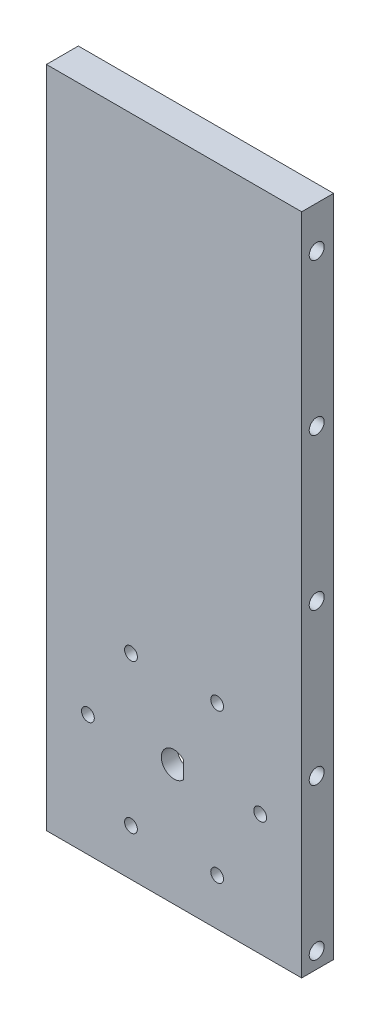
ISO-10303-21;
HEADER;
FILE_DESCRIPTION(('STEP AP214'),'2;1');
FILE_NAME('part.step','',(''),(''),'','','');
FILE_SCHEMA(('AUTOMOTIVE_DESIGN { 1 0 10303 214 1 1 1 1 }'));
ENDSEC;
DATA;
#1=APPLICATION_CONTEXT('core data for automotive mechanical design processes');
#2=APPLICATION_PROTOCOL_DEFINITION('international standard','automotive_design',2000,#1);
#3=PRODUCT_CONTEXT('',#1,'mechanical');
#4=PRODUCT('Part','Part','',(#3));
#5=PRODUCT_RELATED_PRODUCT_CATEGORY('part','',(#4));
#6=PRODUCT_DEFINITION_FORMATION('','',#4);
#7=PRODUCT_DEFINITION_CONTEXT('part definition',#1,'design');
#8=PRODUCT_DEFINITION('design','',#6,#7);
#9=PRODUCT_DEFINITION_SHAPE('','',#8);
#10=(LENGTH_UNIT() NAMED_UNIT(*) SI_UNIT(.MILLI.,.METRE.));
#11=(NAMED_UNIT(*) PLANE_ANGLE_UNIT() SI_UNIT($,.RADIAN.));
#12=(NAMED_UNIT(*) SI_UNIT($,.STERADIAN.) SOLID_ANGLE_UNIT());
#13=UNCERTAINTY_MEASURE_WITH_UNIT(LENGTH_MEASURE(1.E-05),#10,'distance_accuracy_value','');
#14=(GEOMETRIC_REPRESENTATION_CONTEXT(3) GLOBAL_UNCERTAINTY_ASSIGNED_CONTEXT((#13)) GLOBAL_UNIT_ASSIGNED_CONTEXT((#10,
#11,#12)) REPRESENTATION_CONTEXT('',''));
#15=CARTESIAN_POINT('',(0.,0.,0.));
#16=DIRECTION('',(0.,0.,1.));
#17=DIRECTION('',(1.,0.,0.));
#18=AXIS2_PLACEMENT_3D('',#15,#16,#17);
#19=CARTESIAN_POINT('',(40.,30.,0.));
#20=DIRECTION('',(0.,0.,1.));
#21=DIRECTION('',(1.,0.,0.));
#22=AXIS2_PLACEMENT_3D('',#19,#20,#21);
#23=CYLINDRICAL_SURFACE('',#22,4.);
#24=CARTESIAN_POINT('',(40.,30.,5.));
#25=DIRECTION('',(0.,0.,-1.));
#26=DIRECTION('',(-1.,0.,0.));
#27=AXIS2_PLACEMENT_3D('',#24,#25,#26);
#28=CIRCLE('',#27,4.);
#29=CARTESIAN_POINT('',(42.9047375096555,32.75,5.));
#30=VERTEX_POINT('',#29);
#31=CARTESIAN_POINT('',(42.9047375096555,27.25,5.));
#32=VERTEX_POINT('',#31);
#33=EDGE_CURVE('E61',#30,#32,#28,.F.);
#34=ORIENTED_EDGE('',*,*,#33,.F.);
#35=DIRECTION('',(0.,0.,1.));
#36=VECTOR('',#35,1.);
#37=CARTESIAN_POINT('',(42.9047375096555,32.75,0.));
#38=LINE('',#37,#36);
#39=CARTESIAN_POINT('',(42.9047375096555,32.75,10.));
#40=VERTEX_POINT('',#39);
#41=EDGE_CURVE('E113',#30,#40,#38,.T.);
#42=ORIENTED_EDGE('',*,*,#41,.T.);
#43=CARTESIAN_POINT('',(40.,30.,10.));
#44=DIRECTION('',(0.,0.,1.));
#45=DIRECTION('',(1.,0.,0.));
#46=AXIS2_PLACEMENT_3D('',#43,#44,#45);
#47=CIRCLE('',#46,4.);
#48=CARTESIAN_POINT('',(42.9047375096555,27.25,10.));
#49=VERTEX_POINT('',#48);
#50=EDGE_CURVE('E176',#40,#49,#47,.T.);
#51=ORIENTED_EDGE('',*,*,#50,.T.);
#52=DIRECTION('',(0.,0.,1.));
#53=VECTOR('',#52,1.);
#54=CARTESIAN_POINT('',(42.9047375096555,27.25,0.));
#55=LINE('',#54,#53);
#56=EDGE_CURVE('E68',#32,#49,#55,.T.);
#57=ORIENTED_EDGE('',*,*,#56,.F.);
#58=EDGE_LOOP('',(#34,#42,#51,#57));
#59=FACE_BOUND('',#58,.T.);
#60=ADVANCED_FACE('F45',(#59),#23,.F.);
#61=CARTESIAN_POINT('',(42.9047375096555,27.25,0.));
#62=DIRECTION('',(1.,0.,0.));
#63=DIRECTION('',(0.,0.,-1.));
#64=AXIS2_PLACEMENT_3D('',#61,#62,#63);
#65=PLANE('',#64);
#66=DIRECTION('',(0.,1.,0.));
#67=VECTOR('',#66,1.);
#68=CARTESIAN_POINT('',(42.9047375096555,27.25,5.));
#69=LINE('',#68,#67);
#70=EDGE_CURVE('E166',#32,#30,#69,.T.);
#71=ORIENTED_EDGE('',*,*,#70,.F.);
#72=ORIENTED_EDGE('',*,*,#56,.T.);
#73=DIRECTION('',(0.,1.,0.));
#74=VECTOR('',#73,1.);
#75=CARTESIAN_POINT('',(42.9047375096555,27.25,10.));
#76=LINE('',#75,#74);
#77=EDGE_CURVE('E198',#49,#40,#76,.T.);
#78=ORIENTED_EDGE('',*,*,#77,.T.);
#79=ORIENTED_EDGE('',*,*,#41,.F.);
#80=EDGE_LOOP('',(#71,#72,#78,#79));
#81=FACE_BOUND('',#80,.T.);
#82=ADVANCED_FACE('F245',(#81),#65,.F.);
#83=CARTESIAN_POINT('',(26.5,6.61731409782015,10.));
#84=DIRECTION('',(0.,0.,-1.));
#85=DIRECTION('',(-1.,0.,0.));
#86=AXIS2_PLACEMENT_3D('',#83,#84,#85);
#87=CYLINDRICAL_SURFACE('',#86,2.00000000000001);
#88=CARTESIAN_POINT('',(26.5,6.61731409782015,10.));
#89=DIRECTION('',(0.,0.,-1.));
#90=DIRECTION('',(-1.,0.,0.));
#91=AXIS2_PLACEMENT_3D('',#88,#89,#90);
#92=CIRCLE('',#91,2.00000000000001);
#93=CARTESIAN_POINT('',(24.5,6.61731409782015,10.));
#94=VERTEX_POINT('',#93);
#95=EDGE_CURVE('E177',#94,#94,#92,.T.);
#96=ORIENTED_EDGE('',*,*,#95,.F.);
#97=EDGE_LOOP('',(#96));
#98=FACE_BOUND('',#97,.T.);
#99=CARTESIAN_POINT('',(26.5,6.61731409782015,5.));
#100=DIRECTION('',(0.,0.,-1.));
#101=DIRECTION('',(-1.,0.,0.));
#102=AXIS2_PLACEMENT_3D('',#99,#100,#101);
#103=CIRCLE('',#102,2.00000000000001);
#104=CARTESIAN_POINT('',(24.5,6.61731409782015,5.));
#105=VERTEX_POINT('',#104);
#106=EDGE_CURVE('E162',#105,#105,#103,.F.);
#107=ORIENTED_EDGE('',*,*,#106,.F.);
#108=EDGE_LOOP('',(#107));
#109=FACE_BOUND('',#108,.T.);
#110=ADVANCED_FACE('F252',(#98,#109),#87,.F.);
#111=CARTESIAN_POINT('',(53.5,6.61731409782015,10.));
#112=DIRECTION('',(0.,0.,-1.));
#113=DIRECTION('',(-1.,0.,0.));
#114=AXIS2_PLACEMENT_3D('',#111,#112,#113);
#115=CYLINDRICAL_SURFACE('',#114,2.);
#116=CARTESIAN_POINT('',(53.5,6.61731409782015,10.));
#117=DIRECTION('',(0.,0.,-1.));
#118=DIRECTION('',(-1.,0.,0.));
#119=AXIS2_PLACEMENT_3D('',#116,#117,#118);
#120=CIRCLE('',#119,2.);
#121=CARTESIAN_POINT('',(51.5,6.61731409782015,10.));
#122=VERTEX_POINT('',#121);
#123=EDGE_CURVE('E185',#122,#122,#120,.T.);
#124=ORIENTED_EDGE('',*,*,#123,.F.);
#125=EDGE_LOOP('',(#124));
#126=FACE_BOUND('',#125,.T.);
#127=CARTESIAN_POINT('',(53.5,6.61731409782015,5.));
#128=DIRECTION('',(0.,0.,-1.));
#129=DIRECTION('',(-1.,0.,0.));
#130=AXIS2_PLACEMENT_3D('',#127,#128,#129);
#131=CIRCLE('',#130,2.);
#132=CARTESIAN_POINT('',(51.5,6.61731409782015,5.));
#133=VERTEX_POINT('',#132);
#134=EDGE_CURVE('E158',#133,#133,#131,.F.);
#135=ORIENTED_EDGE('',*,*,#134,.F.);
#136=EDGE_LOOP('',(#135));
#137=FACE_BOUND('',#136,.T.);
#138=ADVANCED_FACE('F625',(#126,#137),#115,.F.);
#139=CARTESIAN_POINT('',(67.,30.,10.));
#140=DIRECTION('',(0.,0.,-1.));
#141=DIRECTION('',(-1.,0.,0.));
#142=AXIS2_PLACEMENT_3D('',#139,#140,#141);
#143=CYLINDRICAL_SURFACE('',#142,2.);
#144=CARTESIAN_POINT('',(67.,30.,10.));
#145=DIRECTION('',(0.,0.,-1.));
#146=DIRECTION('',(-1.,0.,0.));
#147=AXIS2_PLACEMENT_3D('',#144,#145,#146);
#148=CIRCLE('',#147,2.);
#149=CARTESIAN_POINT('',(65.,30.,10.));
#150=VERTEX_POINT('',#149);
#151=EDGE_CURVE('E189',#150,#150,#148,.T.);
#152=ORIENTED_EDGE('',*,*,#151,.F.);
#153=EDGE_LOOP('',(#152));
#154=FACE_BOUND('',#153,.T.);
#155=CARTESIAN_POINT('',(67.,30.,5.));
#156=DIRECTION('',(0.,0.,-1.));
#157=DIRECTION('',(-1.,0.,0.));
#158=AXIS2_PLACEMENT_3D('',#155,#156,#157);
#159=CIRCLE('',#158,2.);
#160=CARTESIAN_POINT('',(65.,30.,5.));
#161=VERTEX_POINT('',#160);
#162=EDGE_CURVE('E154',#161,#161,#159,.F.);
#163=ORIENTED_EDGE('',*,*,#162,.F.);
#164=EDGE_LOOP('',(#163));
#165=FACE_BOUND('',#164,.T.);
#166=ADVANCED_FACE('F635',(#154,#165),#143,.F.);
#167=CARTESIAN_POINT('',(53.5,53.3826859021799,10.));
#168=DIRECTION('',(0.,0.,-1.));
#169=DIRECTION('',(-1.,0.,0.));
#170=AXIS2_PLACEMENT_3D('',#167,#168,#169);
#171=CYLINDRICAL_SURFACE('',#170,2.);
#172=CARTESIAN_POINT('',(53.5,53.3826859021799,10.));
#173=DIRECTION('',(0.,0.,-1.));
#174=DIRECTION('',(-1.,0.,0.));
#175=AXIS2_PLACEMENT_3D('',#172,#173,#174);
#176=CIRCLE('',#175,2.);
#177=CARTESIAN_POINT('',(51.5,53.3826859021799,10.));
#178=VERTEX_POINT('',#177);
#179=EDGE_CURVE('E181',#178,#178,#176,.T.);
#180=ORIENTED_EDGE('',*,*,#179,.F.);
#181=EDGE_LOOP('',(#180));
#182=FACE_BOUND('',#181,.T.);
#183=CARTESIAN_POINT('',(53.5,53.3826859021799,5.));
#184=DIRECTION('',(0.,0.,-1.));
#185=DIRECTION('',(-1.,0.,0.));
#186=AXIS2_PLACEMENT_3D('',#183,#184,#185);
#187=CIRCLE('',#186,2.);
#188=CARTESIAN_POINT('',(51.5,53.3826859021799,5.));
#189=VERTEX_POINT('',#188);
#190=EDGE_CURVE('E150',#189,#189,#187,.F.);
#191=ORIENTED_EDGE('',*,*,#190,.F.);
#192=EDGE_LOOP('',(#191));
#193=FACE_BOUND('',#192,.T.);
#194=ADVANCED_FACE('F239',(#182,#193),#171,.F.);
#195=CARTESIAN_POINT('',(26.5,53.3826859021799,10.));
#196=DIRECTION('',(0.,0.,-1.));
#197=DIRECTION('',(-1.,0.,0.));
#198=AXIS2_PLACEMENT_3D('',#195,#196,#197);
#199=CYLINDRICAL_SURFACE('',#198,2.);
#200=CARTESIAN_POINT('',(26.5,53.3826859021799,10.));
#201=DIRECTION('',(0.,0.,-1.));
#202=DIRECTION('',(-1.,0.,0.));
#203=AXIS2_PLACEMENT_3D('',#200,#201,#202);
#204=CIRCLE('',#203,2.);
#205=CARTESIAN_POINT('',(24.5,53.3826859021799,10.));
#206=VERTEX_POINT('',#205);
#207=EDGE_CURVE('E171',#206,#206,#204,.T.);
#208=ORIENTED_EDGE('',*,*,#207,.F.);
#209=EDGE_LOOP('',(#208));
#210=FACE_BOUND('',#209,.T.);
#211=CARTESIAN_POINT('',(26.5,53.3826859021799,5.));
#212=DIRECTION('',(0.,0.,-1.));
#213=DIRECTION('',(-1.,0.,0.));
#214=AXIS2_PLACEMENT_3D('',#211,#212,#213);
#215=CIRCLE('',#214,2.);
#216=CARTESIAN_POINT('',(24.5,53.3826859021799,5.));
#217=VERTEX_POINT('',#216);
#218=EDGE_CURVE('E146',#217,#217,#215,.F.);
#219=ORIENTED_EDGE('',*,*,#218,.F.);
#220=EDGE_LOOP('',(#219));
#221=FACE_BOUND('',#220,.T.);
#222=ADVANCED_FACE('F229',(#210,#221),#199,.F.);
#223=CARTESIAN_POINT('',(13.,30.,10.));
#224=DIRECTION('',(0.,0.,-1.));
#225=DIRECTION('',(-1.,0.,0.));
#226=AXIS2_PLACEMENT_3D('',#223,#224,#225);
#227=CYLINDRICAL_SURFACE('',#226,2.);
#228=CARTESIAN_POINT('',(13.,30.,10.));
#229=DIRECTION('',(0.,0.,-1.));
#230=DIRECTION('',(-1.,0.,0.));
#231=AXIS2_PLACEMENT_3D('',#228,#229,#230);
#232=CIRCLE('',#231,2.);
#233=CARTESIAN_POINT('',(11.,30.,10.));
#234=VERTEX_POINT('',#233);
#235=EDGE_CURVE('E172',#234,#234,#232,.T.);
#236=ORIENTED_EDGE('',*,*,#235,.F.);
#237=EDGE_LOOP('',(#236));
#238=FACE_BOUND('',#237,.T.);
#239=CARTESIAN_POINT('',(13.,30.,5.));
#240=DIRECTION('',(0.,0.,-1.));
#241=DIRECTION('',(-1.,0.,0.));
#242=AXIS2_PLACEMENT_3D('',#239,#240,#241);
#243=CIRCLE('',#242,2.);
#244=CARTESIAN_POINT('',(11.,30.,5.));
#245=VERTEX_POINT('',#244);
#246=EDGE_CURVE('E49',#245,#245,#243,.F.);
#247=ORIENTED_EDGE('',*,*,#246,.F.);
#248=EDGE_LOOP('',(#247));
#249=FACE_BOUND('',#248,.T.);
#250=ADVANCED_FACE('F227',(#238,#249),#227,.F.);
#251=CARTESIAN_POINT('',(0.,0.,10.));
#252=DIRECTION('',(1.,0.,0.));
#253=DIRECTION('',(0.,1.,0.));
#254=AXIS2_PLACEMENT_3D('',#251,#252,#253);
#255=PLANE('',#254);
#256=CARTESIAN_POINT('',(0.,187.,5.));
#257=DIRECTION('',(-1.,0.,0.));
#258=DIRECTION('',(0.,-1.,0.));
#259=AXIS2_PLACEMENT_3D('',#256,#257,#258);
#260=CIRCLE('',#259,2.34999999999999);
#261=CARTESIAN_POINT('',(0.,184.65,5.));
#262=VERTEX_POINT('',#261);
#263=EDGE_CURVE('E310',#262,#262,#260,.T.);
#264=ORIENTED_EDGE('',*,*,#263,.F.);
#265=EDGE_LOOP('',(#264));
#266=FACE_BOUND('',#265,.T.);
#267=CARTESIAN_POINT('',(0.,139.5,5.));
#268=DIRECTION('',(-1.,0.,0.));
#269=DIRECTION('',(0.,-1.,0.));
#270=AXIS2_PLACEMENT_3D('',#267,#268,#269);
#271=CIRCLE('',#270,2.34999999999999);
#272=CARTESIAN_POINT('',(0.,137.15,5.));
#273=VERTEX_POINT('',#272);
#274=EDGE_CURVE('E314',#273,#273,#271,.T.);
#275=ORIENTED_EDGE('',*,*,#274,.F.);
#276=EDGE_LOOP('',(#275));
#277=FACE_BOUND('',#276,.T.);
#278=CARTESIAN_POINT('',(0.,92.,5.));
#279=DIRECTION('',(-1.,0.,0.));
#280=DIRECTION('',(0.,-1.,0.));
#281=AXIS2_PLACEMENT_3D('',#278,#279,#280);
#282=CIRCLE('',#281,2.35);
#283=CARTESIAN_POINT('',(0.,89.65,5.));
#284=VERTEX_POINT('',#283);
#285=EDGE_CURVE('E322',#284,#284,#282,.T.);
#286=ORIENTED_EDGE('',*,*,#285,.F.);
#287=EDGE_LOOP('',(#286));
#288=FACE_BOUND('',#287,.T.);
#289=CARTESIAN_POINT('',(0.,44.5,5.));
#290=DIRECTION('',(-1.,0.,0.));
#291=DIRECTION('',(0.,-1.,0.));
#292=AXIS2_PLACEMENT_3D('',#289,#290,#291);
#293=CIRCLE('',#292,2.35);
#294=CARTESIAN_POINT('',(0.,42.15,5.));
#295=VERTEX_POINT('',#294);
#296=EDGE_CURVE('E330',#295,#295,#293,.T.);
#297=ORIENTED_EDGE('',*,*,#296,.F.);
#298=EDGE_LOOP('',(#297));
#299=FACE_BOUND('',#298,.T.);
#300=CARTESIAN_POINT('',(0.,-2.99999999999995,5.));
#301=DIRECTION('',(-1.,0.,0.));
#302=DIRECTION('',(0.,-1.,0.));
#303=AXIS2_PLACEMENT_3D('',#300,#301,#302);
#304=CIRCLE('',#303,2.35);
#305=CARTESIAN_POINT('',(0.,-5.34999999999995,5.));
#306=VERTEX_POINT('',#305);
#307=EDGE_CURVE('E337',#306,#306,#304,.T.);
#308=ORIENTED_EDGE('',*,*,#307,.F.);
#309=EDGE_LOOP('',(#308));
#310=FACE_BOUND('',#309,.T.);
#311=DIRECTION('',(0.,-1.,0.));
#312=VECTOR('',#311,1.);
#313=CARTESIAN_POINT('',(0.,0.,0.));
#314=LINE('',#313,#312);
#315=CARTESIAN_POINT('',(0.,200.,0.));
#316=VERTEX_POINT('',#315);
#317=CARTESIAN_POINT('',(0.,-8.,0.));
#318=VERTEX_POINT('',#317);
#319=EDGE_CURVE('E102',#316,#318,#314,.T.);
#320=ORIENTED_EDGE('',*,*,#319,.T.);
#321=DIRECTION('',(0.,0.,1.));
#322=VECTOR('',#321,1.);
#323=CARTESIAN_POINT('',(0.,-8.,0.));
#324=LINE('',#323,#322);
#325=CARTESIAN_POINT('',(0.,-8.,10.));
#326=VERTEX_POINT('',#325);
#327=EDGE_CURVE('E105',#318,#326,#324,.T.);
#328=ORIENTED_EDGE('',*,*,#327,.T.);
#329=DIRECTION('',(0.,-1.,0.));
#330=VECTOR('',#329,1.);
#331=CARTESIAN_POINT('',(0.,0.,10.));
#332=LINE('',#331,#330);
#333=CARTESIAN_POINT('',(0.,200.,10.));
#334=VERTEX_POINT('',#333);
#335=EDGE_CURVE('E205',#334,#326,#332,.T.);
#336=ORIENTED_EDGE('',*,*,#335,.F.);
#337=DIRECTION('',(0.,0.,-1.));
#338=VECTOR('',#337,1.);
#339=CARTESIAN_POINT('',(0.,200.,10.));
#340=LINE('',#339,#338);
#341=EDGE_CURVE('E55',#334,#316,#340,.T.);
#342=ORIENTED_EDGE('',*,*,#341,.T.);
#343=EDGE_LOOP('',(#320,#328,#336,#342));
#344=FACE_BOUND('',#343,.T.);
#345=ADVANCED_FACE('F47',(#266,#277,#288,#299,#310,#344),#255,.F.);
#346=CARTESIAN_POINT('',(80.,0.,10.));
#347=DIRECTION('',(-1.,0.,0.));
#348=DIRECTION('',(0.,-1.,0.));
#349=AXIS2_PLACEMENT_3D('',#346,#347,#348);
#350=PLANE('',#349);
#351=CARTESIAN_POINT('',(80.,187.,5.28576423001526));
#352=DIRECTION('',(1.,0.,0.));
#353=DIRECTION('',(0.,1.,0.));
#354=AXIS2_PLACEMENT_3D('',#351,#352,#353);
#355=CIRCLE('',#354,2.35);
#356=CARTESIAN_POINT('',(80.,189.35,5.28576423001526));
#357=VERTEX_POINT('',#356);
#358=EDGE_CURVE('E274',#357,#357,#355,.T.);
#359=ORIENTED_EDGE('',*,*,#358,.F.);
#360=EDGE_LOOP('',(#359));
#361=FACE_BOUND('',#360,.T.);
#362=CARTESIAN_POINT('',(80.,139.5,5.28576423001526));
#363=DIRECTION('',(1.,0.,0.));
#364=DIRECTION('',(0.,1.,0.));
#365=AXIS2_PLACEMENT_3D('',#362,#363,#364);
#366=CIRCLE('',#365,2.35);
#367=CARTESIAN_POINT('',(80.,141.85,5.28576423001526));
#368=VERTEX_POINT('',#367);
#369=EDGE_CURVE('E278',#368,#368,#366,.T.);
#370=ORIENTED_EDGE('',*,*,#369,.F.);
#371=EDGE_LOOP('',(#370));
#372=FACE_BOUND('',#371,.T.);
#373=CARTESIAN_POINT('',(80.,92.,5.28576423001526));
#374=DIRECTION('',(1.,0.,0.));
#375=DIRECTION('',(0.,1.,0.));
#376=AXIS2_PLACEMENT_3D('',#373,#374,#375);
#377=CIRCLE('',#376,2.35);
#378=CARTESIAN_POINT('',(80.,94.35,5.28576423001526));
#379=VERTEX_POINT('',#378);
#380=EDGE_CURVE('E282',#379,#379,#377,.T.);
#381=ORIENTED_EDGE('',*,*,#380,.F.);
#382=EDGE_LOOP('',(#381));
#383=FACE_BOUND('',#382,.T.);
#384=CARTESIAN_POINT('',(80.,44.5,5.28576423001526));
#385=DIRECTION('',(1.,0.,0.));
#386=DIRECTION('',(0.,1.,0.));
#387=AXIS2_PLACEMENT_3D('',#384,#385,#386);
#388=CIRCLE('',#387,2.35);
#389=CARTESIAN_POINT('',(80.,46.85,5.28576423001526));
#390=VERTEX_POINT('',#389);
#391=EDGE_CURVE('E286',#390,#390,#388,.T.);
#392=ORIENTED_EDGE('',*,*,#391,.F.);
#393=EDGE_LOOP('',(#392));
#394=FACE_BOUND('',#393,.T.);
#395=CARTESIAN_POINT('',(80.,-2.99999999999999,5.28576423001526));
#396=DIRECTION('',(1.,0.,0.));
#397=DIRECTION('',(0.,1.,0.));
#398=AXIS2_PLACEMENT_3D('',#395,#396,#397);
#399=CIRCLE('',#398,2.35);
#400=CARTESIAN_POINT('',(80.,-0.649999999999994,5.28576423001526));
#401=VERTEX_POINT('',#400);
#402=EDGE_CURVE('E290',#401,#401,#399,.T.);
#403=ORIENTED_EDGE('',*,*,#402,.F.);
#404=EDGE_LOOP('',(#403));
#405=FACE_BOUND('',#404,.T.);
#406=DIRECTION('',(0.,1.,0.));
#407=VECTOR('',#406,1.);
#408=CARTESIAN_POINT('',(80.,0.,0.));
#409=LINE('',#408,#407);
#410=CARTESIAN_POINT('',(80.,-8.,0.));
#411=VERTEX_POINT('',#410);
#412=CARTESIAN_POINT('',(80.,200.,0.));
#413=VERTEX_POINT('',#412);
#414=EDGE_CURVE('E112',#411,#413,#409,.T.);
#415=ORIENTED_EDGE('',*,*,#414,.T.);
#416=DIRECTION('',(0.,0.,-1.));
#417=VECTOR('',#416,1.);
#418=CARTESIAN_POINT('',(80.,200.,10.));
#419=LINE('',#418,#417);
#420=CARTESIAN_POINT('',(80.,200.,10.));
#421=VERTEX_POINT('',#420);
#422=EDGE_CURVE('E11',#421,#413,#419,.T.);
#423=ORIENTED_EDGE('',*,*,#422,.F.);
#424=DIRECTION('',(0.,1.,0.));
#425=VECTOR('',#424,1.);
#426=CARTESIAN_POINT('',(80.,0.,10.));
#427=LINE('',#426,#425);
#428=CARTESIAN_POINT('',(80.,-8.,10.));
#429=VERTEX_POINT('',#428);
#430=EDGE_CURVE('E208',#429,#421,#427,.T.);
#431=ORIENTED_EDGE('',*,*,#430,.F.);
#432=DIRECTION('',(0.,0.,1.));
#433=VECTOR('',#432,1.);
#434=CARTESIAN_POINT('',(80.,-8.,0.));
#435=LINE('',#434,#433);
#436=EDGE_CURVE('E123',#411,#429,#435,.T.);
#437=ORIENTED_EDGE('',*,*,#436,.F.);
#438=EDGE_LOOP('',(#415,#423,#431,#437));
#439=FACE_BOUND('',#438,.T.);
#440=ADVANCED_FACE('F237',(#361,#372,#383,#394,#405,#439),#350,.F.);
#441=CARTESIAN_POINT('',(0.,200.,10.));
#442=DIRECTION('',(0.,-1.,0.));
#443=DIRECTION('',(0.,0.,-1.));
#444=AXIS2_PLACEMENT_3D('',#441,#442,#443);
#445=PLANE('',#444);
#446=DIRECTION('',(-1.,0.,0.));
#447=VECTOR('',#446,1.);
#448=CARTESIAN_POINT('',(0.,200.,0.));
#449=LINE('',#448,#447);
#450=EDGE_CURVE('E209',#413,#316,#449,.T.);
#451=ORIENTED_EDGE('',*,*,#450,.T.);
#452=ORIENTED_EDGE('',*,*,#341,.F.);
#453=DIRECTION('',(-1.,0.,0.));
#454=VECTOR('',#453,1.);
#455=CARTESIAN_POINT('',(0.,200.,10.));
#456=LINE('',#455,#454);
#457=EDGE_CURVE('E212',#421,#334,#456,.T.);
#458=ORIENTED_EDGE('',*,*,#457,.F.);
#459=ORIENTED_EDGE('',*,*,#422,.T.);
#460=EDGE_LOOP('',(#451,#452,#458,#459));
#461=FACE_BOUND('',#460,.T.);
#462=ADVANCED_FACE('F258',(#461),#445,.F.);
#463=CARTESIAN_POINT('',(0.,0.,10.));
#464=DIRECTION('',(0.,0.,-1.));
#465=DIRECTION('',(-1.,0.,0.));
#466=AXIS2_PLACEMENT_3D('',#463,#464,#465);
#467=PLANE('',#466);
#468=ORIENTED_EDGE('',*,*,#235,.T.);
#469=EDGE_LOOP('',(#468));
#470=FACE_BOUND('',#469,.T.);
#471=ORIENTED_EDGE('',*,*,#207,.T.);
#472=EDGE_LOOP('',(#471));
#473=FACE_BOUND('',#472,.T.);
#474=ORIENTED_EDGE('',*,*,#179,.T.);
#475=EDGE_LOOP('',(#474));
#476=FACE_BOUND('',#475,.T.);
#477=ORIENTED_EDGE('',*,*,#151,.T.);
#478=EDGE_LOOP('',(#477));
#479=FACE_BOUND('',#478,.T.);
#480=ORIENTED_EDGE('',*,*,#123,.T.);
#481=EDGE_LOOP('',(#480));
#482=FACE_BOUND('',#481,.T.);
#483=ORIENTED_EDGE('',*,*,#95,.T.);
#484=EDGE_LOOP('',(#483));
#485=FACE_BOUND('',#484,.T.);
#486=ORIENTED_EDGE('',*,*,#77,.F.);
#487=ORIENTED_EDGE('',*,*,#50,.F.);
#488=EDGE_LOOP('',(#486,#487));
#489=FACE_BOUND('',#488,.T.);
#490=ORIENTED_EDGE('',*,*,#335,.T.);
#491=DIRECTION('',(1.,0.,0.));
#492=VECTOR('',#491,1.);
#493=CARTESIAN_POINT('',(0.,-8.,10.));
#494=LINE('',#493,#492);
#495=EDGE_CURVE('E121',#326,#429,#494,.T.);
#496=ORIENTED_EDGE('',*,*,#495,.T.);
#497=ORIENTED_EDGE('',*,*,#430,.T.);
#498=ORIENTED_EDGE('',*,*,#457,.T.);
#499=EDGE_LOOP('',(#490,#496,#497,#498));
#500=FACE_BOUND('',#499,.T.);
#501=ADVANCED_FACE('F256',(#470,#473,#476,#479,#482,#485,#489,#500),#467,.F.);
#502=CARTESIAN_POINT('',(0.,0.,0.));
#503=DIRECTION('',(0.,0.,-1.));
#504=DIRECTION('',(-1.,0.,0.));
#505=AXIS2_PLACEMENT_3D('',#502,#503,#504);
#506=PLANE('',#505);
#507=CARTESIAN_POINT('',(40.,30.,0.));
#508=DIRECTION('',(0.,0.,-1.));
#509=DIRECTION('',(-1.,0.,0.));
#510=AXIS2_PLACEMENT_3D('',#507,#508,#509);
#511=CIRCLE('',#510,35.);
#512=CARTESIAN_POINT('',(4.99999999999996,30.,0.));
#513=VERTEX_POINT('',#512);
#514=EDGE_CURVE('E137',#513,#513,#511,.T.);
#515=ORIENTED_EDGE('',*,*,#514,.F.);
#516=EDGE_LOOP('',(#515));
#517=FACE_BOUND('',#516,.T.);
#518=DIRECTION('',(1.,0.,0.));
#519=VECTOR('',#518,1.);
#520=CARTESIAN_POINT('',(0.,-8.,0.));
#521=LINE('',#520,#519);
#522=EDGE_CURVE('E119',#318,#411,#521,.T.);
#523=ORIENTED_EDGE('',*,*,#522,.F.);
#524=ORIENTED_EDGE('',*,*,#319,.F.);
#525=ORIENTED_EDGE('',*,*,#450,.F.);
#526=ORIENTED_EDGE('',*,*,#414,.F.);
#527=EDGE_LOOP('',(#523,#524,#525,#526));
#528=FACE_BOUND('',#527,.T.);
#529=ADVANCED_FACE('F125',(#517,#528),#506,.T.);
#530=CARTESIAN_POINT('',(40.,30.,5.));
#531=DIRECTION('',(0.,0.,-1.));
#532=DIRECTION('',(-1.,0.,0.));
#533=AXIS2_PLACEMENT_3D('',#530,#531,#532);
#534=CYLINDRICAL_SURFACE('',#533,35.);
#535=ORIENTED_EDGE('',*,*,#514,.T.);
#536=EDGE_LOOP('',(#535));
#537=FACE_BOUND('',#536,.T.);
#538=CARTESIAN_POINT('',(40.,30.,5.));
#539=DIRECTION('',(0.,0.,-1.));
#540=DIRECTION('',(-1.,0.,0.));
#541=AXIS2_PLACEMENT_3D('',#538,#539,#540);
#542=CIRCLE('',#541,35.);
#543=CARTESIAN_POINT('',(4.99999999999996,30.,5.));
#544=VERTEX_POINT('',#543);
#545=EDGE_CURVE('E139',#544,#544,#542,.T.);
#546=ORIENTED_EDGE('',*,*,#545,.F.);
#547=EDGE_LOOP('',(#546));
#548=FACE_BOUND('',#547,.T.);
#549=ADVANCED_FACE('F262',(#537,#548),#534,.F.);
#550=CARTESIAN_POINT('',(40.,30.,5.));
#551=DIRECTION('',(0.,0.,-1.));
#552=DIRECTION('',(-1.,0.,0.));
#553=AXIS2_PLACEMENT_3D('',#550,#551,#552);
#554=PLANE('',#553);
#555=ORIENTED_EDGE('',*,*,#33,.T.);
#556=ORIENTED_EDGE('',*,*,#70,.T.);
#557=EDGE_LOOP('',(#555,#556));
#558=FACE_BOUND('',#557,.T.);
#559=ORIENTED_EDGE('',*,*,#246,.T.);
#560=EDGE_LOOP('',(#559));
#561=FACE_BOUND('',#560,.T.);
#562=ORIENTED_EDGE('',*,*,#218,.T.);
#563=EDGE_LOOP('',(#562));
#564=FACE_BOUND('',#563,.T.);
#565=ORIENTED_EDGE('',*,*,#190,.T.);
#566=EDGE_LOOP('',(#565));
#567=FACE_BOUND('',#566,.T.);
#568=ORIENTED_EDGE('',*,*,#162,.T.);
#569=EDGE_LOOP('',(#568));
#570=FACE_BOUND('',#569,.T.);
#571=ORIENTED_EDGE('',*,*,#134,.T.);
#572=EDGE_LOOP('',(#571));
#573=FACE_BOUND('',#572,.T.);
#574=ORIENTED_EDGE('',*,*,#106,.T.);
#575=EDGE_LOOP('',(#574));
#576=FACE_BOUND('',#575,.T.);
#577=ORIENTED_EDGE('',*,*,#545,.T.);
#578=EDGE_LOOP('',(#577));
#579=FACE_BOUND('',#578,.T.);
#580=ADVANCED_FACE('F224',(#558,#561,#564,#567,#570,#573,#576,#579),#554,.T.);
#581=CARTESIAN_POINT('',(0.,-8.,0.));
#582=DIRECTION('',(0.,-1.,0.));
#583=DIRECTION('',(0.,0.,-1.));
#584=AXIS2_PLACEMENT_3D('',#581,#582,#583);
#585=PLANE('',#584);
#586=ORIENTED_EDGE('',*,*,#495,.F.);
#587=ORIENTED_EDGE('',*,*,#327,.F.);
#588=ORIENTED_EDGE('',*,*,#522,.T.);
#589=ORIENTED_EDGE('',*,*,#436,.T.);
#590=EDGE_LOOP('',(#586,#587,#588,#589));
#591=FACE_BOUND('',#590,.T.);
#592=ADVANCED_FACE('F117',(#591),#585,.T.);
#593=CARTESIAN_POINT('',(5.,-2.99999999999995,5.));
#594=DIRECTION('',(-1.,0.,0.));
#595=DIRECTION('',(0.,-1.,0.));
#596=AXIS2_PLACEMENT_3D('',#593,#594,#595);
#597=CYLINDRICAL_SURFACE('',#596,2.35);
#598=CARTESIAN_POINT('',(5.,-2.99999999999995,5.));
#599=DIRECTION('',(-1.,0.,0.));
#600=DIRECTION('',(0.,-1.,0.));
#601=AXIS2_PLACEMENT_3D('',#598,#599,#600);
#602=CIRCLE('',#601,2.35);
#603=CARTESIAN_POINT('',(5.,-5.34999999999994,5.));
#604=VERTEX_POINT('',#603);
#605=EDGE_CURVE('E133',#604,#604,#602,.T.);
#606=ORIENTED_EDGE('',*,*,#605,.F.);
#607=EDGE_LOOP('',(#606));
#608=FACE_BOUND('',#607,.T.);
#609=ORIENTED_EDGE('',*,*,#307,.T.);
#610=EDGE_LOOP('',(#609));
#611=FACE_BOUND('',#610,.T.);
#612=ADVANCED_FACE('F423',(#608,#611),#597,.F.);
#613=CARTESIAN_POINT('',(5.,-2.99999999999995,5.));
#614=DIRECTION('',(-1.,0.,0.));
#615=DIRECTION('',(0.,-1.,0.));
#616=AXIS2_PLACEMENT_3D('',#613,#614,#615);
#617=PLANE('',#616);
#618=ORIENTED_EDGE('',*,*,#605,.T.);
#619=EDGE_LOOP('',(#618));
#620=FACE_BOUND('',#619,.T.);
#621=ADVANCED_FACE('F418',(#620),#617,.T.);
#622=CARTESIAN_POINT('',(4.99999999999999,44.5,5.));
#623=DIRECTION('',(-1.,0.,0.));
#624=DIRECTION('',(0.,-1.,0.));
#625=AXIS2_PLACEMENT_3D('',#622,#623,#624);
#626=CYLINDRICAL_SURFACE('',#625,2.35);
#627=CARTESIAN_POINT('',(4.99999999999999,44.5,5.));
#628=DIRECTION('',(-1.,0.,0.));
#629=DIRECTION('',(0.,-1.,0.));
#630=AXIS2_PLACEMENT_3D('',#627,#628,#629);
#631=CIRCLE('',#630,2.35);
#632=CARTESIAN_POINT('',(4.99999999999999,42.15,5.));
#633=VERTEX_POINT('',#632);
#634=EDGE_CURVE('E334',#633,#633,#631,.T.);
#635=ORIENTED_EDGE('',*,*,#634,.F.);
#636=EDGE_LOOP('',(#635));
#637=FACE_BOUND('',#636,.T.);
#638=ORIENTED_EDGE('',*,*,#296,.T.);
#639=EDGE_LOOP('',(#638));
#640=FACE_BOUND('',#639,.T.);
#641=ADVANCED_FACE('F415',(#637,#640),#626,.F.);
#642=CARTESIAN_POINT('',(4.99999999999999,44.5,5.));
#643=DIRECTION('',(-1.,0.,0.));
#644=DIRECTION('',(0.,-1.,0.));
#645=AXIS2_PLACEMENT_3D('',#642,#643,#644);
#646=PLANE('',#645);
#647=ORIENTED_EDGE('',*,*,#634,.T.);
#648=EDGE_LOOP('',(#647));
#649=FACE_BOUND('',#648,.T.);
#650=ADVANCED_FACE('F410',(#649),#646,.T.);
#651=CARTESIAN_POINT('',(4.99999999999998,92.,5.));
#652=DIRECTION('',(-1.,0.,0.));
#653=DIRECTION('',(0.,-1.,0.));
#654=AXIS2_PLACEMENT_3D('',#651,#652,#653);
#655=CYLINDRICAL_SURFACE('',#654,2.35);
#656=CARTESIAN_POINT('',(4.99999999999998,92.,5.));
#657=DIRECTION('',(-1.,0.,0.));
#658=DIRECTION('',(0.,-1.,0.));
#659=AXIS2_PLACEMENT_3D('',#656,#657,#658);
#660=CIRCLE('',#659,2.35);
#661=CARTESIAN_POINT('',(4.99999999999998,89.65,5.));
#662=VERTEX_POINT('',#661);
#663=EDGE_CURVE('E326',#662,#662,#660,.T.);
#664=ORIENTED_EDGE('',*,*,#663,.F.);
#665=EDGE_LOOP('',(#664));
#666=FACE_BOUND('',#665,.T.);
#667=ORIENTED_EDGE('',*,*,#285,.T.);
#668=EDGE_LOOP('',(#667));
#669=FACE_BOUND('',#668,.T.);
#670=ADVANCED_FACE('F407',(#666,#669),#655,.F.);
#671=CARTESIAN_POINT('',(4.99999999999998,92.,5.));
#672=DIRECTION('',(-1.,0.,0.));
#673=DIRECTION('',(0.,-1.,0.));
#674=AXIS2_PLACEMENT_3D('',#671,#672,#673);
#675=PLANE('',#674);
#676=ORIENTED_EDGE('',*,*,#663,.T.);
#677=EDGE_LOOP('',(#676));
#678=FACE_BOUND('',#677,.T.);
#679=ADVANCED_FACE('F402',(#678),#675,.T.);
#680=CARTESIAN_POINT('',(4.99999999999998,139.5,5.));
#681=DIRECTION('',(-1.,0.,0.));
#682=DIRECTION('',(0.,-1.,0.));
#683=AXIS2_PLACEMENT_3D('',#680,#681,#682);
#684=CYLINDRICAL_SURFACE('',#683,2.34999999999999);
#685=CARTESIAN_POINT('',(4.99999999999998,139.5,5.));
#686=DIRECTION('',(-1.,0.,0.));
#687=DIRECTION('',(0.,-1.,0.));
#688=AXIS2_PLACEMENT_3D('',#685,#686,#687);
#689=CIRCLE('',#688,2.34999999999999);
#690=CARTESIAN_POINT('',(4.99999999999998,137.15,5.));
#691=VERTEX_POINT('',#690);
#692=EDGE_CURVE('E318',#691,#691,#689,.T.);
#693=ORIENTED_EDGE('',*,*,#692,.F.);
#694=EDGE_LOOP('',(#693));
#695=FACE_BOUND('',#694,.T.);
#696=ORIENTED_EDGE('',*,*,#274,.T.);
#697=EDGE_LOOP('',(#696));
#698=FACE_BOUND('',#697,.T.);
#699=ADVANCED_FACE('F399',(#695,#698),#684,.F.);
#700=CARTESIAN_POINT('',(4.99999999999998,139.5,5.));
#701=DIRECTION('',(-1.,0.,0.));
#702=DIRECTION('',(0.,-1.,0.));
#703=AXIS2_PLACEMENT_3D('',#700,#701,#702);
#704=PLANE('',#703);
#705=ORIENTED_EDGE('',*,*,#692,.T.);
#706=EDGE_LOOP('',(#705));
#707=FACE_BOUND('',#706,.T.);
#708=ADVANCED_FACE('F397',(#707),#704,.T.);
#709=CARTESIAN_POINT('',(4.99999999999997,187.,5.));
#710=DIRECTION('',(-1.,0.,0.));
#711=DIRECTION('',(0.,-1.,0.));
#712=AXIS2_PLACEMENT_3D('',#709,#710,#711);
#713=CYLINDRICAL_SURFACE('',#712,2.34999999999999);
#714=CARTESIAN_POINT('',(4.99999999999997,187.,5.));
#715=DIRECTION('',(-1.,0.,0.));
#716=DIRECTION('',(0.,-1.,0.));
#717=AXIS2_PLACEMENT_3D('',#714,#715,#716);
#718=CIRCLE('',#717,2.34999999999999);
#719=CARTESIAN_POINT('',(4.99999999999997,184.65,5.));
#720=VERTEX_POINT('',#719);
#721=EDGE_CURVE('E130',#720,#720,#718,.T.);
#722=ORIENTED_EDGE('',*,*,#721,.F.);
#723=EDGE_LOOP('',(#722));
#724=FACE_BOUND('',#723,.T.);
#725=ORIENTED_EDGE('',*,*,#263,.T.);
#726=EDGE_LOOP('',(#725));
#727=FACE_BOUND('',#726,.T.);
#728=ADVANCED_FACE('F393',(#724,#727),#713,.F.);
#729=CARTESIAN_POINT('',(4.99999999999997,187.,5.));
#730=DIRECTION('',(-1.,0.,0.));
#731=DIRECTION('',(0.,-1.,0.));
#732=AXIS2_PLACEMENT_3D('',#729,#730,#731);
#733=PLANE('',#732);
#734=ORIENTED_EDGE('',*,*,#721,.T.);
#735=EDGE_LOOP('',(#734));
#736=FACE_BOUND('',#735,.T.);
#737=ADVANCED_FACE('F389',(#736),#733,.T.);
#738=CARTESIAN_POINT('',(75.,-2.99999999999999,5.28576423001526));
#739=DIRECTION('',(1.,0.,0.));
#740=DIRECTION('',(0.,1.,0.));
#741=AXIS2_PLACEMENT_3D('',#738,#739,#740);
#742=CYLINDRICAL_SURFACE('',#741,2.35);
#743=CARTESIAN_POINT('',(75.,-2.99999999999999,5.28576423001526));
#744=DIRECTION('',(1.,0.,0.));
#745=DIRECTION('',(0.,1.,0.));
#746=AXIS2_PLACEMENT_3D('',#743,#744,#745);
#747=CIRCLE('',#746,2.35);
#748=CARTESIAN_POINT('',(75.,-0.649999999999995,5.28576423001526));
#749=VERTEX_POINT('',#748);
#750=EDGE_CURVE('E297',#749,#749,#747,.T.);
#751=ORIENTED_EDGE('',*,*,#750,.F.);
#752=EDGE_LOOP('',(#751));
#753=FACE_BOUND('',#752,.T.);
#754=ORIENTED_EDGE('',*,*,#402,.T.);
#755=EDGE_LOOP('',(#754));
#756=FACE_BOUND('',#755,.T.);
#757=ADVANCED_FACE('F381',(#753,#756),#742,.F.);
#758=CARTESIAN_POINT('',(75.,-2.99999999999999,5.28576423001526));
#759=DIRECTION('',(1.,0.,0.));
#760=DIRECTION('',(0.,1.,0.));
#761=AXIS2_PLACEMENT_3D('',#758,#759,#760);
#762=PLANE('',#761);
#763=ORIENTED_EDGE('',*,*,#750,.T.);
#764=EDGE_LOOP('',(#763));
#765=FACE_BOUND('',#764,.T.);
#766=ADVANCED_FACE('F371',(#765),#762,.T.);
#767=CARTESIAN_POINT('',(75.,44.5,5.28576423001526));
#768=DIRECTION('',(1.,0.,0.));
#769=DIRECTION('',(0.,1.,0.));
#770=AXIS2_PLACEMENT_3D('',#767,#768,#769);
#771=CYLINDRICAL_SURFACE('',#770,2.35);
#772=CARTESIAN_POINT('',(75.,44.5,5.28576423001526));
#773=DIRECTION('',(1.,0.,0.));
#774=DIRECTION('',(0.,1.,0.));
#775=AXIS2_PLACEMENT_3D('',#772,#773,#774);
#776=CIRCLE('',#775,2.35);
#777=CARTESIAN_POINT('',(75.,46.85,5.28576423001526));
#778=VERTEX_POINT('',#777);
#779=EDGE_CURVE('E296',#778,#778,#776,.T.);
#780=ORIENTED_EDGE('',*,*,#779,.F.);
#781=EDGE_LOOP('',(#780));
#782=FACE_BOUND('',#781,.T.);
#783=ORIENTED_EDGE('',*,*,#391,.T.);
#784=EDGE_LOOP('',(#783));
#785=FACE_BOUND('',#784,.T.);
#786=ADVANCED_FACE('F368',(#782,#785),#771,.F.);
#787=CARTESIAN_POINT('',(75.,44.5,5.28576423001526));
#788=DIRECTION('',(1.,0.,0.));
#789=DIRECTION('',(0.,1.,0.));
#790=AXIS2_PLACEMENT_3D('',#787,#788,#789);
#791=PLANE('',#790);
#792=ORIENTED_EDGE('',*,*,#779,.T.);
#793=EDGE_LOOP('',(#792));
#794=FACE_BOUND('',#793,.T.);
#795=ADVANCED_FACE('F370',(#794),#791,.T.);
#796=CARTESIAN_POINT('',(75.,92.,5.28576423001526));
#797=DIRECTION('',(1.,0.,0.));
#798=DIRECTION('',(0.,1.,0.));
#799=AXIS2_PLACEMENT_3D('',#796,#797,#798);
#800=CYLINDRICAL_SURFACE('',#799,2.35);
#801=CARTESIAN_POINT('',(75.,92.,5.28576423001526));
#802=DIRECTION('',(1.,0.,0.));
#803=DIRECTION('',(0.,1.,0.));
#804=AXIS2_PLACEMENT_3D('',#801,#802,#803);
#805=CIRCLE('',#804,2.35);
#806=CARTESIAN_POINT('',(75.,94.35,5.28576423001526));
#807=VERTEX_POINT('',#806);
#808=EDGE_CURVE('E363',#807,#807,#805,.T.);
#809=ORIENTED_EDGE('',*,*,#808,.F.);
#810=EDGE_LOOP('',(#809));
#811=FACE_BOUND('',#810,.T.);
#812=ORIENTED_EDGE('',*,*,#380,.T.);
#813=EDGE_LOOP('',(#812));
#814=FACE_BOUND('',#813,.T.);
#815=ADVANCED_FACE('F378',(#811,#814),#800,.F.);
#816=CARTESIAN_POINT('',(75.,92.,5.28576423001526));
#817=DIRECTION('',(1.,0.,0.));
#818=DIRECTION('',(0.,1.,0.));
#819=AXIS2_PLACEMENT_3D('',#816,#817,#818);
#820=PLANE('',#819);
#821=ORIENTED_EDGE('',*,*,#808,.T.);
#822=EDGE_LOOP('',(#821));
#823=FACE_BOUND('',#822,.T.);
#824=ADVANCED_FACE('F386',(#823),#820,.T.);
#825=CARTESIAN_POINT('',(75.,139.5,5.28576423001526));
#826=DIRECTION('',(1.,0.,0.));
#827=DIRECTION('',(0.,1.,0.));
#828=AXIS2_PLACEMENT_3D('',#825,#826,#827);
#829=CYLINDRICAL_SURFACE('',#828,2.35);
#830=CARTESIAN_POINT('',(75.,139.5,5.28576423001526));
#831=DIRECTION('',(1.,0.,0.));
#832=DIRECTION('',(0.,1.,0.));
#833=AXIS2_PLACEMENT_3D('',#830,#831,#832);
#834=CIRCLE('',#833,2.35);
#835=CARTESIAN_POINT('',(75.,141.85,5.28576423001526));
#836=VERTEX_POINT('',#835);
#837=EDGE_CURVE('E357',#836,#836,#834,.T.);
#838=ORIENTED_EDGE('',*,*,#837,.F.);
#839=EDGE_LOOP('',(#838));
#840=FACE_BOUND('',#839,.T.);
#841=ORIENTED_EDGE('',*,*,#369,.T.);
#842=EDGE_LOOP('',(#841));
#843=FACE_BOUND('',#842,.T.);
#844=ADVANCED_FACE('F543',(#840,#843),#829,.F.);
#845=CARTESIAN_POINT('',(75.,139.5,5.28576423001526));
#846=DIRECTION('',(1.,0.,0.));
#847=DIRECTION('',(0.,1.,0.));
#848=AXIS2_PLACEMENT_3D('',#845,#846,#847);
#849=PLANE('',#848);
#850=ORIENTED_EDGE('',*,*,#837,.T.);
#851=EDGE_LOOP('',(#850));
#852=FACE_BOUND('',#851,.T.);
#853=ADVANCED_FACE('F552',(#852),#849,.T.);
#854=CARTESIAN_POINT('',(75.,187.,5.28576423001526));
#855=DIRECTION('',(1.,0.,0.));
#856=DIRECTION('',(0.,1.,0.));
#857=AXIS2_PLACEMENT_3D('',#854,#855,#856);
#858=CYLINDRICAL_SURFACE('',#857,2.35);
#859=CARTESIAN_POINT('',(75.,187.,5.28576423001526));
#860=DIRECTION('',(1.,0.,0.));
#861=DIRECTION('',(0.,1.,0.));
#862=AXIS2_PLACEMENT_3D('',#859,#860,#861);
#863=CIRCLE('',#862,2.35);
#864=CARTESIAN_POINT('',(75.,189.35,5.28576423001526));
#865=VERTEX_POINT('',#864);
#866=EDGE_CURVE('E344',#865,#865,#863,.T.);
#867=ORIENTED_EDGE('',*,*,#866,.F.);
#868=EDGE_LOOP('',(#867));
#869=FACE_BOUND('',#868,.T.);
#870=ORIENTED_EDGE('',*,*,#358,.T.);
#871=EDGE_LOOP('',(#870));
#872=FACE_BOUND('',#871,.T.);
#873=ADVANCED_FACE('F562',(#869,#872),#858,.F.);
#874=CARTESIAN_POINT('',(75.,187.,5.28576423001526));
#875=DIRECTION('',(1.,0.,0.));
#876=DIRECTION('',(0.,1.,0.));
#877=AXIS2_PLACEMENT_3D('',#874,#875,#876);
#878=PLANE('',#877);
#879=ORIENTED_EDGE('',*,*,#866,.T.);
#880=EDGE_LOOP('',(#879));
#881=FACE_BOUND('',#880,.T.);
#882=ADVANCED_FACE('F572',(#881),#878,.T.);
#883=CLOSED_SHELL('',(#60,#82,#110,#138,#166,#194,#222,#250,#345,#440,#462,#501,#529,#549,#580,
#592,#612,#621,#641,#650,#670,#679,#699,#708,#728,#737,#757,#766,#786,#795,#815,#824,#844,#853,
#873,#882));
#884=MANIFOLD_SOLID_BREP('B2',#883);
#885=ADVANCED_BREP_SHAPE_REPRESENTATION('',(#18,#884),#14);
#886=SHAPE_DEFINITION_REPRESENTATION(#9,#885);
ENDSEC;
END-ISO-10303-21;
